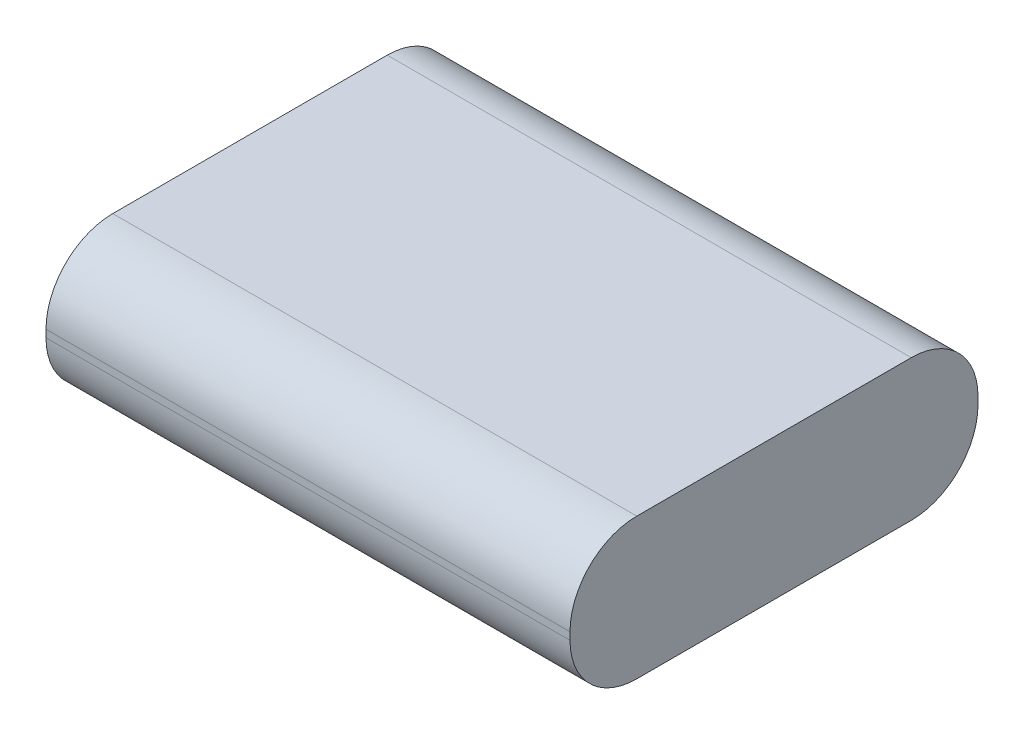
ISO-10303-21;
HEADER;
FILE_DESCRIPTION(('STEP AP214'),'2;1');
FILE_NAME('part.step','',(''),(''),'','','');
FILE_SCHEMA(('AUTOMOTIVE_DESIGN { 1 0 10303 214 1 1 1 1 }'));
ENDSEC;
DATA;
#1=APPLICATION_CONTEXT('core data for automotive mechanical design processes');
#2=APPLICATION_PROTOCOL_DEFINITION('international standard','automotive_design',2000,#1);
#3=PRODUCT_CONTEXT('',#1,'mechanical');
#4=PRODUCT('Part','Part','',(#3));
#5=PRODUCT_RELATED_PRODUCT_CATEGORY('part','',(#4));
#6=PRODUCT_DEFINITION_FORMATION('','',#4);
#7=PRODUCT_DEFINITION_CONTEXT('part definition',#1,'design');
#8=PRODUCT_DEFINITION('design','',#6,#7);
#9=PRODUCT_DEFINITION_SHAPE('','',#8);
#10=(LENGTH_UNIT() NAMED_UNIT(*) SI_UNIT(.MILLI.,.METRE.));
#11=(NAMED_UNIT(*) PLANE_ANGLE_UNIT() SI_UNIT($,.RADIAN.));
#12=(NAMED_UNIT(*) SI_UNIT($,.STERADIAN.) SOLID_ANGLE_UNIT());
#13=UNCERTAINTY_MEASURE_WITH_UNIT(LENGTH_MEASURE(1.E-05),#10,'distance_accuracy_value','');
#14=(GEOMETRIC_REPRESENTATION_CONTEXT(3) GLOBAL_UNCERTAINTY_ASSIGNED_CONTEXT((#13)) GLOBAL_UNIT_ASSIGNED_CONTEXT((#10,
#11,#12)) REPRESENTATION_CONTEXT('',''));
#15=CARTESIAN_POINT('',(0.,0.,0.));
#16=DIRECTION('',(0.,0.,1.));
#17=DIRECTION('',(1.,0.,0.));
#18=AXIS2_PLACEMENT_3D('',#15,#16,#17);
#19=CARTESIAN_POINT('',(0.,19.,0.));
#20=DIRECTION('',(1.,0.,0.));
#21=DIRECTION('',(0.,0.,-1.));
#22=AXIS2_PLACEMENT_3D('',#19,#20,#21);
#23=PLANE('',#22);
#24=DIRECTION('',(0.,0.,1.));
#25=VECTOR('',#24,1.);
#26=CARTESIAN_POINT('',(0.,0.,0.));
#27=LINE('',#26,#25);
#28=CARTESIAN_POINT('',(0.,0.,-46.));
#29=VERTEX_POINT('',#28);
#30=CARTESIAN_POINT('',(0.,0.,-9.));
#31=VERTEX_POINT('',#30);
#32=EDGE_CURVE('E127',#29,#31,#27,.T.);
#33=ORIENTED_EDGE('',*,*,#32,.T.);
#34=CARTESIAN_POINT('',(0.,9.,-9.));
#35=DIRECTION('',(1.,0.,0.));
#36=DIRECTION('',(0.,0.,-1.));
#37=AXIS2_PLACEMENT_3D('',#34,#35,#36);
#38=CIRCLE('',#37,9.);
#39=CARTESIAN_POINT('',(0.,9.,0.));
#40=VERTEX_POINT('',#39);
#41=EDGE_CURVE('E11',#31,#40,#38,.F.);
#42=ORIENTED_EDGE('',*,*,#41,.T.);
#43=DIRECTION('',(0.,-1.,0.));
#44=VECTOR('',#43,1.);
#45=CARTESIAN_POINT('',(0.,19.,0.));
#46=LINE('',#45,#44);
#47=CARTESIAN_POINT('',(0.,10.,0.));
#48=VERTEX_POINT('',#47);
#49=EDGE_CURVE('E118',#48,#40,#46,.T.);
#50=ORIENTED_EDGE('',*,*,#49,.F.);
#51=CARTESIAN_POINT('',(0.,10.,-9.));
#52=DIRECTION('',(1.,0.,0.));
#53=DIRECTION('',(0.,0.,-1.));
#54=AXIS2_PLACEMENT_3D('',#51,#52,#53);
#55=CIRCLE('',#54,9.);
#56=CARTESIAN_POINT('',(0.,19.,-9.));
#57=VERTEX_POINT('',#56);
#58=EDGE_CURVE('E122',#48,#57,#55,.F.);
#59=ORIENTED_EDGE('',*,*,#58,.T.);
#60=DIRECTION('',(0.,0.,1.));
#61=VECTOR('',#60,1.);
#62=CARTESIAN_POINT('',(0.,19.,0.));
#63=LINE('',#62,#61);
#64=CARTESIAN_POINT('',(0.,19.,-46.));
#65=VERTEX_POINT('',#64);
#66=EDGE_CURVE('E113',#65,#57,#63,.T.);
#67=ORIENTED_EDGE('',*,*,#66,.F.);
#68=CARTESIAN_POINT('',(0.,10.,-46.));
#69=DIRECTION('',(1.,0.,0.));
#70=DIRECTION('',(0.,0.,-1.));
#71=AXIS2_PLACEMENT_3D('',#68,#69,#70);
#72=CIRCLE('',#71,9.);
#73=CARTESIAN_POINT('',(0.,10.,-55.));
#74=VERTEX_POINT('',#73);
#75=EDGE_CURVE('E98',#65,#74,#72,.F.);
#76=ORIENTED_EDGE('',*,*,#75,.T.);
#77=DIRECTION('',(0.,-1.,0.));
#78=VECTOR('',#77,1.);
#79=CARTESIAN_POINT('',(0.,19.,-55.));
#80=LINE('',#79,#78);
#81=CARTESIAN_POINT('',(0.,9.,-55.));
#82=VERTEX_POINT('',#81);
#83=EDGE_CURVE('E125',#74,#82,#80,.T.);
#84=ORIENTED_EDGE('',*,*,#83,.T.);
#85=CARTESIAN_POINT('',(0.,9.,-46.));
#86=DIRECTION('',(1.,0.,0.));
#87=DIRECTION('',(0.,0.,-1.));
#88=AXIS2_PLACEMENT_3D('',#85,#86,#87);
#89=CIRCLE('',#88,9.);
#90=EDGE_CURVE('E145',#82,#29,#89,.F.);
#91=ORIENTED_EDGE('',*,*,#90,.T.);
#92=EDGE_LOOP('',(#33,#42,#50,#59,#67,#76,#84,#91));
#93=FACE_BOUND('',#92,.T.);
#94=ADVANCED_FACE('F34',(#93),#23,.F.);
#95=CARTESIAN_POINT('',(0.,19.,0.));
#96=DIRECTION('',(0.,0.,-1.));
#97=DIRECTION('',(-1.,0.,0.));
#98=AXIS2_PLACEMENT_3D('',#95,#96,#97);
#99=PLANE('',#98);
#100=ORIENTED_EDGE('',*,*,#49,.T.);
#101=DIRECTION('',(1.,0.,0.));
#102=VECTOR('',#101,1.);
#103=CARTESIAN_POINT('',(70.64,9.,0.));
#104=LINE('',#103,#102);
#105=CARTESIAN_POINT('',(70.64,9.,0.));
#106=VERTEX_POINT('',#105);
#107=EDGE_CURVE('E159',#40,#106,#104,.T.);
#108=ORIENTED_EDGE('',*,*,#107,.T.);
#109=DIRECTION('',(0.,-1.,0.));
#110=VECTOR('',#109,1.);
#111=CARTESIAN_POINT('',(70.64,19.,0.));
#112=LINE('',#111,#110);
#113=CARTESIAN_POINT('',(70.64,10.,0.));
#114=VERTEX_POINT('',#113);
#115=EDGE_CURVE('E135',#114,#106,#112,.T.);
#116=ORIENTED_EDGE('',*,*,#115,.F.);
#117=DIRECTION('',(1.,0.,0.));
#118=VECTOR('',#117,1.);
#119=CARTESIAN_POINT('',(0.,10.,0.));
#120=LINE('',#119,#118);
#121=EDGE_CURVE('E156',#114,#48,#120,.F.);
#122=ORIENTED_EDGE('',*,*,#121,.T.);
#123=EDGE_LOOP('',(#100,#108,#116,#122));
#124=FACE_BOUND('',#123,.T.);
#125=ADVANCED_FACE('F165',(#124),#99,.F.);
#126=CARTESIAN_POINT('',(70.64,19.,0.));
#127=DIRECTION('',(-1.,0.,0.));
#128=DIRECTION('',(0.,0.,1.));
#129=AXIS2_PLACEMENT_3D('',#126,#127,#128);
#130=PLANE('',#129);
#131=ORIENTED_EDGE('',*,*,#115,.T.);
#132=CARTESIAN_POINT('',(70.64,9.,-9.));
#133=DIRECTION('',(-1.,0.,0.));
#134=DIRECTION('',(0.,0.,1.));
#135=AXIS2_PLACEMENT_3D('',#132,#133,#134);
#136=CIRCLE('',#135,9.);
#137=CARTESIAN_POINT('',(70.64,0.,-9.));
#138=VERTEX_POINT('',#137);
#139=EDGE_CURVE('E56',#106,#138,#136,.F.);
#140=ORIENTED_EDGE('',*,*,#139,.T.);
#141=DIRECTION('',(0.,0.,-1.));
#142=VECTOR('',#141,1.);
#143=CARTESIAN_POINT('',(70.64,0.,0.));
#144=LINE('',#143,#142);
#145=CARTESIAN_POINT('',(70.64,0.,-46.));
#146=VERTEX_POINT('',#145);
#147=EDGE_CURVE('E123',#138,#146,#144,.T.);
#148=ORIENTED_EDGE('',*,*,#147,.T.);
#149=CARTESIAN_POINT('',(70.64,9.,-46.));
#150=DIRECTION('',(-1.,0.,0.));
#151=DIRECTION('',(0.,0.,1.));
#152=AXIS2_PLACEMENT_3D('',#149,#150,#151);
#153=CIRCLE('',#152,9.);
#154=CARTESIAN_POINT('',(70.64,9.,-55.));
#155=VERTEX_POINT('',#154);
#156=EDGE_CURVE('E150',#146,#155,#153,.F.);
#157=ORIENTED_EDGE('',*,*,#156,.T.);
#158=DIRECTION('',(0.,-1.,0.));
#159=VECTOR('',#158,1.);
#160=CARTESIAN_POINT('',(70.64,19.,-55.));
#161=LINE('',#160,#159);
#162=CARTESIAN_POINT('',(70.64,10.,-55.));
#163=VERTEX_POINT('',#162);
#164=EDGE_CURVE('E132',#163,#155,#161,.T.);
#165=ORIENTED_EDGE('',*,*,#164,.F.);
#166=CARTESIAN_POINT('',(70.64,10.,-46.));
#167=DIRECTION('',(-1.,0.,0.));
#168=DIRECTION('',(0.,0.,1.));
#169=AXIS2_PLACEMENT_3D('',#166,#167,#168);
#170=CIRCLE('',#169,9.);
#171=CARTESIAN_POINT('',(70.64,19.,-46.));
#172=VERTEX_POINT('',#171);
#173=EDGE_CURVE('E140',#163,#172,#170,.F.);
#174=ORIENTED_EDGE('',*,*,#173,.T.);
#175=DIRECTION('',(0.,0.,-1.));
#176=VECTOR('',#175,1.);
#177=CARTESIAN_POINT('',(70.64,19.,0.));
#178=LINE('',#177,#176);
#179=CARTESIAN_POINT('',(70.64,19.,-9.));
#180=VERTEX_POINT('',#179);
#181=EDGE_CURVE('E116',#180,#172,#178,.T.);
#182=ORIENTED_EDGE('',*,*,#181,.F.);
#183=CARTESIAN_POINT('',(70.64,10.,-9.));
#184=DIRECTION('',(-1.,0.,0.));
#185=DIRECTION('',(0.,0.,1.));
#186=AXIS2_PLACEMENT_3D('',#183,#184,#185);
#187=CIRCLE('',#186,9.);
#188=EDGE_CURVE('E154',#180,#114,#187,.F.);
#189=ORIENTED_EDGE('',*,*,#188,.T.);
#190=EDGE_LOOP('',(#131,#140,#148,#157,#165,#174,#182,#189));
#191=FACE_BOUND('',#190,.T.);
#192=ADVANCED_FACE('F169',(#191),#130,.F.);
#193=CARTESIAN_POINT('',(0.,19.,-55.));
#194=DIRECTION('',(0.,0.,1.));
#195=DIRECTION('',(1.,0.,0.));
#196=AXIS2_PLACEMENT_3D('',#193,#194,#195);
#197=PLANE('',#196);
#198=ORIENTED_EDGE('',*,*,#164,.T.);
#199=DIRECTION('',(-1.,0.,0.));
#200=VECTOR('',#199,1.);
#201=CARTESIAN_POINT('',(0.,9.,-55.));
#202=LINE('',#201,#200);
#203=EDGE_CURVE('E142',#155,#82,#202,.T.);
#204=ORIENTED_EDGE('',*,*,#203,.T.);
#205=ORIENTED_EDGE('',*,*,#83,.F.);
#206=DIRECTION('',(-1.,0.,0.));
#207=VECTOR('',#206,1.);
#208=CARTESIAN_POINT('',(0.,10.,-55.));
#209=LINE('',#208,#207);
#210=EDGE_CURVE('E103',#74,#163,#209,.F.);
#211=ORIENTED_EDGE('',*,*,#210,.T.);
#212=EDGE_LOOP('',(#198,#204,#205,#211));
#213=FACE_BOUND('',#212,.T.);
#214=ADVANCED_FACE('F197',(#213),#197,.F.);
#215=CARTESIAN_POINT('',(0.,19.,0.));
#216=DIRECTION('',(0.,-1.,0.));
#217=DIRECTION('',(0.,0.,-1.));
#218=AXIS2_PLACEMENT_3D('',#215,#216,#217);
#219=PLANE('',#218);
#220=ORIENTED_EDGE('',*,*,#66,.T.);
#221=DIRECTION('',(1.,0.,0.));
#222=VECTOR('',#221,1.);
#223=CARTESIAN_POINT('',(0.,19.,-9.));
#224=LINE('',#223,#222);
#225=EDGE_CURVE('E152',#57,#180,#224,.T.);
#226=ORIENTED_EDGE('',*,*,#225,.T.);
#227=ORIENTED_EDGE('',*,*,#181,.T.);
#228=DIRECTION('',(-1.,0.,0.));
#229=VECTOR('',#228,1.);
#230=CARTESIAN_POINT('',(0.,19.,-46.));
#231=LINE('',#230,#229);
#232=EDGE_CURVE('E102',#172,#65,#231,.T.);
#233=ORIENTED_EDGE('',*,*,#232,.T.);
#234=EDGE_LOOP('',(#220,#226,#227,#233));
#235=FACE_BOUND('',#234,.T.);
#236=ADVANCED_FACE('F111',(#235),#219,.F.);
#237=CARTESIAN_POINT('',(0.,0.,0.));
#238=DIRECTION('',(0.,-1.,0.));
#239=DIRECTION('',(0.,0.,-1.));
#240=AXIS2_PLACEMENT_3D('',#237,#238,#239);
#241=PLANE('',#240);
#242=ORIENTED_EDGE('',*,*,#147,.F.);
#243=DIRECTION('',(1.,0.,0.));
#244=VECTOR('',#243,1.);
#245=CARTESIAN_POINT('',(0.,0.,-9.));
#246=LINE('',#245,#244);
#247=EDGE_CURVE('E42',#138,#31,#246,.F.);
#248=ORIENTED_EDGE('',*,*,#247,.T.);
#249=ORIENTED_EDGE('',*,*,#32,.F.);
#250=DIRECTION('',(-1.,0.,0.));
#251=VECTOR('',#250,1.);
#252=CARTESIAN_POINT('',(70.64,0.,-46.));
#253=LINE('',#252,#251);
#254=EDGE_CURVE('E147',#29,#146,#253,.F.);
#255=ORIENTED_EDGE('',*,*,#254,.T.);
#256=EDGE_LOOP('',(#242,#248,#249,#255));
#257=FACE_BOUND('',#256,.T.);
#258=ADVANCED_FACE('F187',(#257),#241,.T.);
#259=CARTESIAN_POINT('',(0.,10.,-46.));
#260=DIRECTION('',(-1.,0.,0.));
#261=DIRECTION('',(0.,0.,1.));
#262=AXIS2_PLACEMENT_3D('',#259,#260,#261);
#263=CYLINDRICAL_SURFACE('',#262,9.);
#264=ORIENTED_EDGE('',*,*,#173,.F.);
#265=ORIENTED_EDGE('',*,*,#210,.F.);
#266=ORIENTED_EDGE('',*,*,#75,.F.);
#267=ORIENTED_EDGE('',*,*,#232,.F.);
#268=EDGE_LOOP('',(#264,#265,#266,#267));
#269=FACE_BOUND('',#268,.T.);
#270=ADVANCED_FACE('F101',(#269),#263,.T.);
#271=CARTESIAN_POINT('',(0.,9.,-46.));
#272=DIRECTION('',(1.,0.,0.));
#273=DIRECTION('',(0.,0.,-1.));
#274=AXIS2_PLACEMENT_3D('',#271,#272,#273);
#275=CYLINDRICAL_SURFACE('',#274,9.);
#276=ORIENTED_EDGE('',*,*,#156,.F.);
#277=ORIENTED_EDGE('',*,*,#254,.F.);
#278=ORIENTED_EDGE('',*,*,#90,.F.);
#279=ORIENTED_EDGE('',*,*,#203,.F.);
#280=EDGE_LOOP('',(#276,#277,#278,#279));
#281=FACE_BOUND('',#280,.T.);
#282=ADVANCED_FACE('F176',(#281),#275,.T.);
#283=CARTESIAN_POINT('',(0.,10.,-9.));
#284=DIRECTION('',(1.,0.,0.));
#285=DIRECTION('',(0.,0.,-1.));
#286=AXIS2_PLACEMENT_3D('',#283,#284,#285);
#287=CYLINDRICAL_SURFACE('',#286,9.);
#288=ORIENTED_EDGE('',*,*,#58,.F.);
#289=ORIENTED_EDGE('',*,*,#121,.F.);
#290=ORIENTED_EDGE('',*,*,#188,.F.);
#291=ORIENTED_EDGE('',*,*,#225,.F.);
#292=EDGE_LOOP('',(#288,#289,#290,#291));
#293=FACE_BOUND('',#292,.T.);
#294=ADVANCED_FACE('F171',(#293),#287,.T.);
#295=CARTESIAN_POINT('',(0.,9.,-9.));
#296=DIRECTION('',(-1.,0.,0.));
#297=DIRECTION('',(0.,0.,1.));
#298=AXIS2_PLACEMENT_3D('',#295,#296,#297);
#299=CYLINDRICAL_SURFACE('',#298,9.);
#300=ORIENTED_EDGE('',*,*,#41,.F.);
#301=ORIENTED_EDGE('',*,*,#247,.F.);
#302=ORIENTED_EDGE('',*,*,#139,.F.);
#303=ORIENTED_EDGE('',*,*,#107,.F.);
#304=EDGE_LOOP('',(#300,#301,#302,#303));
#305=FACE_BOUND('',#304,.T.);
#306=ADVANCED_FACE('F36',(#305),#299,.T.);
#307=CLOSED_SHELL('',(#94,#125,#192,#214,#236,#258,#270,#282,#294,#306));
#308=MANIFOLD_SOLID_BREP('B2',#307);
#309=ADVANCED_BREP_SHAPE_REPRESENTATION('',(#18,#308),#14);
#310=SHAPE_DEFINITION_REPRESENTATION(#9,#309);
ENDSEC;
END-ISO-10303-21;
